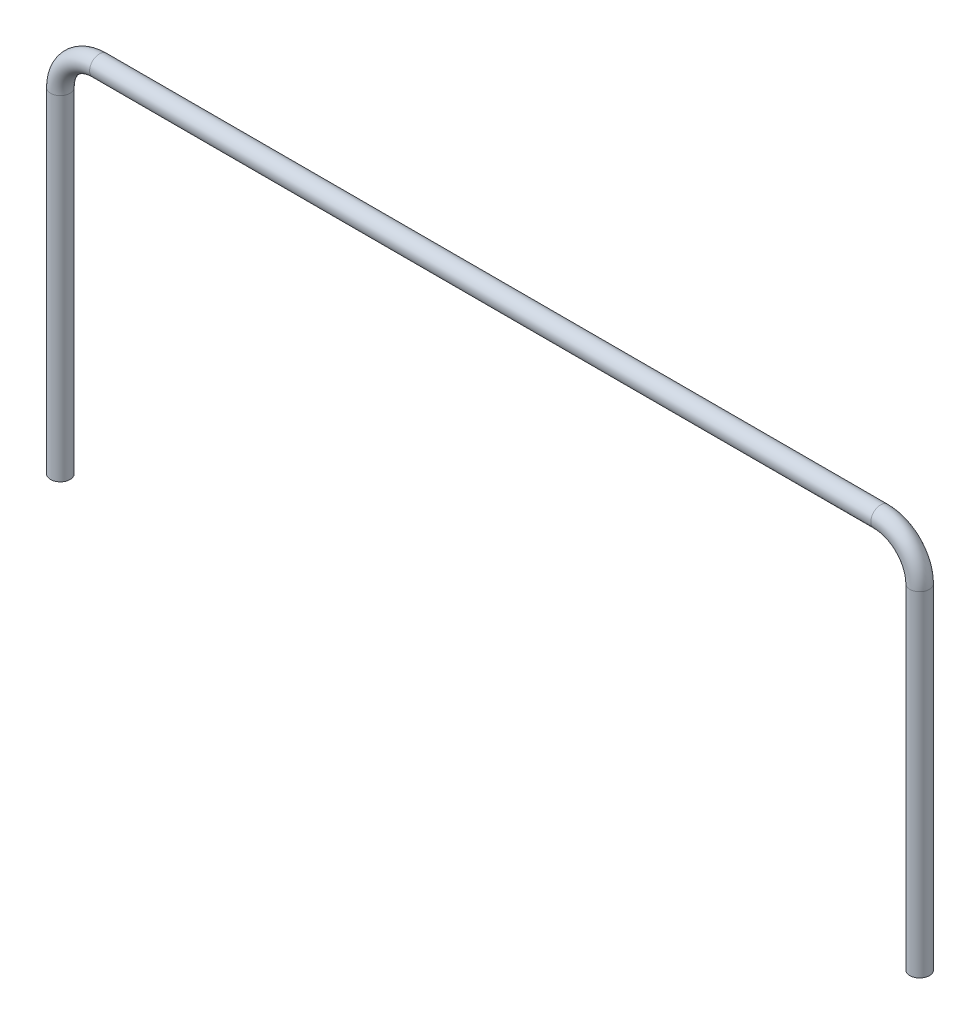
ISO-10303-21;
HEADER;
FILE_DESCRIPTION(('STEP AP214'),'2;1');
FILE_NAME('part.step','',(''),(''),'','','');
FILE_SCHEMA(('AUTOMOTIVE_DESIGN { 1 0 10303 214 1 1 1 1 }'));
ENDSEC;
DATA;
#1=APPLICATION_CONTEXT('core data for automotive mechanical design processes');
#2=APPLICATION_PROTOCOL_DEFINITION('international standard','automotive_design',2000,#1);
#3=PRODUCT_CONTEXT('',#1,'mechanical');
#4=PRODUCT('Part','Part','',(#3));
#5=PRODUCT_RELATED_PRODUCT_CATEGORY('part','',(#4));
#6=PRODUCT_DEFINITION_FORMATION('','',#4);
#7=PRODUCT_DEFINITION_CONTEXT('part definition',#1,'design');
#8=PRODUCT_DEFINITION('design','',#6,#7);
#9=PRODUCT_DEFINITION_SHAPE('','',#8);
#10=(LENGTH_UNIT() NAMED_UNIT(*) SI_UNIT(.MILLI.,.METRE.));
#11=(NAMED_UNIT(*) PLANE_ANGLE_UNIT() SI_UNIT($,.RADIAN.));
#12=(NAMED_UNIT(*) SI_UNIT($,.STERADIAN.) SOLID_ANGLE_UNIT());
#13=UNCERTAINTY_MEASURE_WITH_UNIT(LENGTH_MEASURE(1.E-05),#10,'distance_accuracy_value','');
#14=(GEOMETRIC_REPRESENTATION_CONTEXT(3) GLOBAL_UNCERTAINTY_ASSIGNED_CONTEXT((#13)) GLOBAL_UNIT_ASSIGNED_CONTEXT((#10,
#11,#12)) REPRESENTATION_CONTEXT('',''));
#15=CARTESIAN_POINT('',(0.,0.,0.));
#16=DIRECTION('',(0.,0.,1.));
#17=DIRECTION('',(1.,0.,0.));
#18=AXIS2_PLACEMENT_3D('',#15,#16,#17);
#19=CARTESIAN_POINT('',(35.3211364299463,17.129192579925,0.));
#20=DIRECTION('',(0.,-1.,0.));
#21=DIRECTION('',(0.,0.,-1.));
#22=AXIS2_PLACEMENT_3D('',#19,#20,#21);
#23=CYLINDRICAL_SURFACE('',#22,0.500000000000001);
#24=CARTESIAN_POINT('',(35.3211364299463,17.129192579925,0.));
#25=DIRECTION('',(0.,-1.,0.));
#26=DIRECTION('',(0.,0.,1.));
#27=AXIS2_PLACEMENT_3D('',#24,#25,#26);
#28=CIRCLE('',#27,0.500000000000001);
#29=CARTESIAN_POINT('',(35.8211364299463,17.129192579925,0.));
#30=VERTEX_POINT('',#29);
#31=EDGE_CURVE('E37',#30,#30,#28,.T.);
#32=ORIENTED_EDGE('',*,*,#31,.T.);
#33=EDGE_LOOP('',(#32));
#34=FACE_BOUND('',#33,.T.);
#35=CARTESIAN_POINT('',(35.3211364299463,0.,0.));
#36=DIRECTION('',(0.,-1.,0.));
#37=DIRECTION('',(0.,0.,1.));
#38=AXIS2_PLACEMENT_3D('',#35,#36,#37);
#39=CIRCLE('',#38,0.500000000000001);
#40=CARTESIAN_POINT('',(35.3211364299463,0.,0.500000000000001));
#41=VERTEX_POINT('',#40);
#42=EDGE_CURVE('E10',#41,#41,#39,.T.);
#43=ORIENTED_EDGE('',*,*,#42,.F.);
#44=EDGE_LOOP('',(#43));
#45=FACE_BOUND('',#44,.T.);
#46=ADVANCED_FACE('F31',(#34,#45),#23,.T.);
#47=CARTESIAN_POINT('',(33.3211364299463,17.129192579925,0.));
#48=DIRECTION('',(0.,0.,-1.));
#49=DIRECTION('',(-1.,0.,0.));
#50=AXIS2_PLACEMENT_3D('',#47,#48,#49);
#51=TOROIDAL_SURFACE('',#50,2.,0.500000000000001);
#52=CARTESIAN_POINT('',(33.3211364299463,19.129192579925,0.));
#53=DIRECTION('',(1.,0.,0.));
#54=DIRECTION('',(0.,0.,1.));
#55=AXIS2_PLACEMENT_3D('',#52,#53,#54);
#56=CIRCLE('',#55,0.500000000000001);
#57=CARTESIAN_POINT('',(33.3211364299463,19.629192579925,0.));
#58=VERTEX_POINT('',#57);
#59=EDGE_CURVE('E41',#58,#58,#56,.T.);
#60=CARTESIAN_POINT('',(33.3211364299463,17.129192579925,0.));
#61=DIRECTION('',(0.,0.,-1.));
#62=DIRECTION('',(-1.,0.,0.));
#63=AXIS2_PLACEMENT_3D('',#60,#61,#62);
#64=CIRCLE('',#63,2.5);
#65=EDGE_CURVE('',#58,#30,#64,.T.);
#66=ORIENTED_EDGE('',*,*,#59,.T.);
#67=ORIENTED_EDGE('',*,*,#31,.F.);
#68=ORIENTED_EDGE('',*,*,#65,.T.);
#69=ORIENTED_EDGE('',*,*,#65,.F.);
#70=EDGE_LOOP('',(#66,#68,#67,#69));
#71=FACE_BOUND('',#70,.T.);
#72=ADVANCED_FACE('F75',(#71),#51,.T.);
#73=CARTESIAN_POINT('',(-6.67886357005372,19.129192579925,0.));
#74=DIRECTION('',(1.,0.,0.));
#75=DIRECTION('',(0.,1.,0.));
#76=AXIS2_PLACEMENT_3D('',#73,#74,#75);
#77=CYLINDRICAL_SURFACE('',#76,0.500000000000001);
#78=CARTESIAN_POINT('',(-6.67886357005372,19.129192579925,0.));
#79=DIRECTION('',(1.,0.,0.));
#80=DIRECTION('',(0.,0.,1.));
#81=AXIS2_PLACEMENT_3D('',#78,#79,#80);
#82=CIRCLE('',#81,0.500000000000001);
#83=CARTESIAN_POINT('',(-6.67886357005372,19.629192579925,0.));
#84=VERTEX_POINT('',#83);
#85=EDGE_CURVE('E45',#84,#84,#82,.T.);
#86=ORIENTED_EDGE('',*,*,#85,.T.);
#87=EDGE_LOOP('',(#86));
#88=FACE_BOUND('',#87,.T.);
#89=ORIENTED_EDGE('',*,*,#59,.F.);
#90=EDGE_LOOP('',(#89));
#91=FACE_BOUND('',#90,.T.);
#92=ADVANCED_FACE('F79',(#88,#91),#77,.T.);
#93=CARTESIAN_POINT('',(-6.67886357005372,17.129192579925,0.));
#94=DIRECTION('',(0.,0.,-1.));
#95=DIRECTION('',(-1.,0.,0.));
#96=AXIS2_PLACEMENT_3D('',#93,#94,#95);
#97=TOROIDAL_SURFACE('',#96,2.,0.500000000000001);
#98=CARTESIAN_POINT('',(-8.67886357005371,17.129192579925,0.));
#99=DIRECTION('',(0.,1.,0.));
#100=DIRECTION('',(0.,0.,1.));
#101=AXIS2_PLACEMENT_3D('',#98,#99,#100);
#102=CIRCLE('',#101,0.500000000000001);
#103=CARTESIAN_POINT('',(-9.17886357005371,17.129192579925,0.));
#104=VERTEX_POINT('',#103);
#105=EDGE_CURVE('E50',#104,#104,#102,.T.);
#106=CARTESIAN_POINT('',(-6.67886357005372,17.129192579925,0.));
#107=DIRECTION('',(0.,0.,-1.));
#108=DIRECTION('',(-1.,0.,0.));
#109=AXIS2_PLACEMENT_3D('',#106,#107,#108);
#110=CIRCLE('',#109,2.5);
#111=EDGE_CURVE('',#104,#84,#110,.T.);
#112=ORIENTED_EDGE('',*,*,#105,.T.);
#113=ORIENTED_EDGE('',*,*,#85,.F.);
#114=ORIENTED_EDGE('',*,*,#111,.T.);
#115=ORIENTED_EDGE('',*,*,#111,.F.);
#116=EDGE_LOOP('',(#112,#114,#113,#115));
#117=FACE_BOUND('',#116,.T.);
#118=ADVANCED_FACE('F57',(#117),#97,.T.);
#119=CARTESIAN_POINT('',(-8.67886357005371,17.129192579925,0.));
#120=DIRECTION('',(0.,-1.,0.));
#121=DIRECTION('',(1.,0.,0.));
#122=AXIS2_PLACEMENT_3D('',#119,#120,#121);
#123=CYLINDRICAL_SURFACE('',#122,0.500000000000001);
#124=ORIENTED_EDGE('',*,*,#105,.F.);
#125=EDGE_LOOP('',(#124));
#126=FACE_BOUND('',#125,.T.);
#127=CARTESIAN_POINT('',(-8.67886357005372,0.,0.));
#128=DIRECTION('',(0.,1.,0.));
#129=DIRECTION('',(0.,0.,1.));
#130=AXIS2_PLACEMENT_3D('',#127,#128,#129);
#131=CIRCLE('',#130,0.500000000000001);
#132=CARTESIAN_POINT('',(-8.67886357005372,0.,0.500000000000001));
#133=VERTEX_POINT('',#132);
#134=EDGE_CURVE('E51',#133,#133,#131,.T.);
#135=ORIENTED_EDGE('',*,*,#134,.T.);
#136=EDGE_LOOP('',(#135));
#137=FACE_BOUND('',#136,.T.);
#138=ADVANCED_FACE('F60',(#126,#137),#123,.T.);
#139=CARTESIAN_POINT('',(35.3211364299463,0.,0.));
#140=DIRECTION('',(0.,-1.,0.));
#141=DIRECTION('',(0.,0.,1.));
#142=AXIS2_PLACEMENT_3D('',#139,#140,#141);
#143=PLANE('',#142);
#144=ORIENTED_EDGE('',*,*,#42,.T.);
#145=EDGE_LOOP('',(#144));
#146=FACE_BOUND('',#145,.T.);
#147=ADVANCED_FACE('F63',(#146),#143,.T.);
#148=CARTESIAN_POINT('',(-8.67886357005372,0.,0.));
#149=DIRECTION('',(0.,1.,0.));
#150=DIRECTION('',(0.,0.,1.));
#151=AXIS2_PLACEMENT_3D('',#148,#149,#150);
#152=PLANE('',#151);
#153=ORIENTED_EDGE('',*,*,#134,.F.);
#154=EDGE_LOOP('',(#153));
#155=FACE_BOUND('',#154,.T.);
#156=ADVANCED_FACE('F67',(#155),#152,.F.);
#157=CLOSED_SHELL('',(#46,#72,#92,#118,#138,#147,#156));
#158=MANIFOLD_SOLID_BREP('B2',#157);
#159=ADVANCED_BREP_SHAPE_REPRESENTATION('',(#18,#158),#14);
#160=SHAPE_DEFINITION_REPRESENTATION(#9,#159);
ENDSEC;
END-ISO-10303-21;
